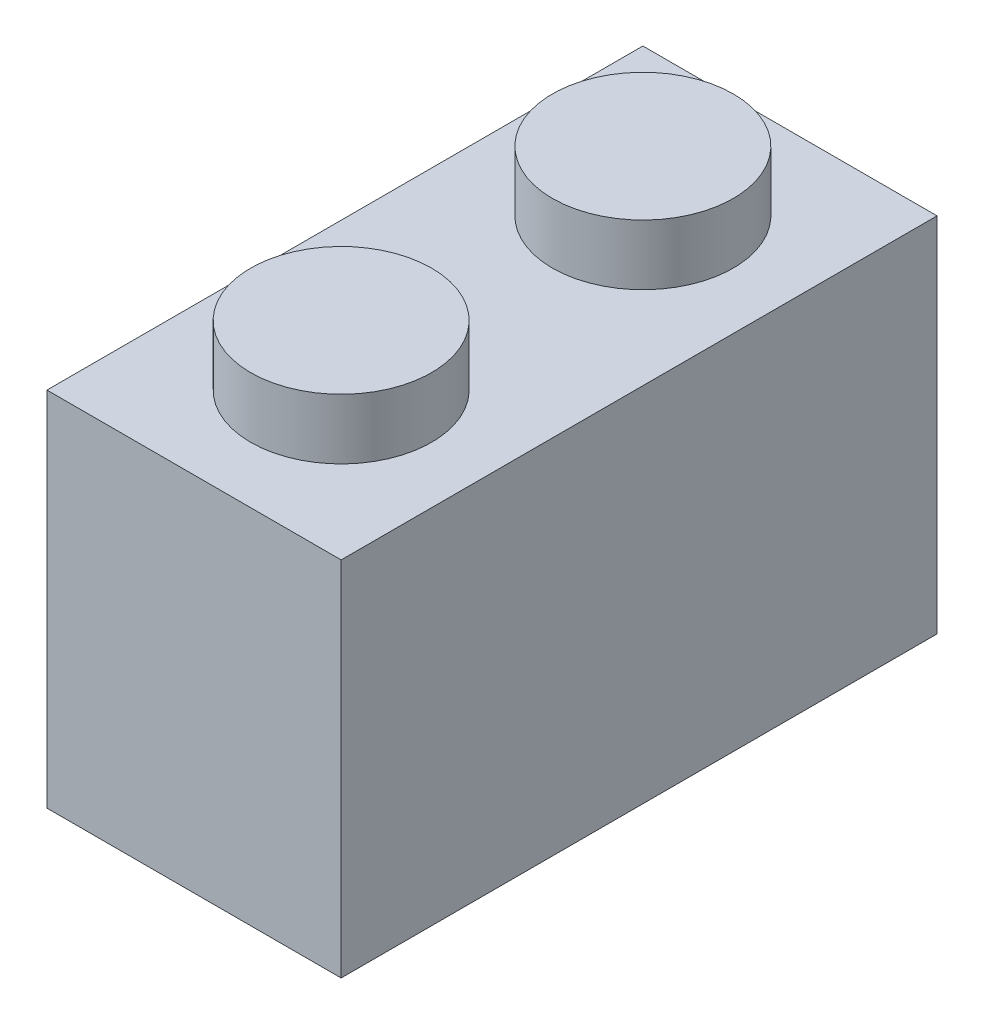
ISO-10303-21;
HEADER;
FILE_DESCRIPTION(('STEP AP214'),'2;1');
FILE_NAME('part.step','',(''),(''),'','','');
FILE_SCHEMA(('AUTOMOTIVE_DESIGN { 1 0 10303 214 1 1 1 1 }'));
ENDSEC;
DATA;
#1=APPLICATION_CONTEXT('core data for automotive mechanical design processes');
#2=APPLICATION_PROTOCOL_DEFINITION('international standard','automotive_design',2000,#1);
#3=PRODUCT_CONTEXT('',#1,'mechanical');
#4=PRODUCT('Part','Part','',(#3));
#5=PRODUCT_RELATED_PRODUCT_CATEGORY('part','',(#4));
#6=PRODUCT_DEFINITION_FORMATION('','',#4);
#7=PRODUCT_DEFINITION_CONTEXT('part definition',#1,'design');
#8=PRODUCT_DEFINITION('design','',#6,#7);
#9=PRODUCT_DEFINITION_SHAPE('','',#8);
#10=(LENGTH_UNIT() NAMED_UNIT(*) SI_UNIT(.MILLI.,.METRE.));
#11=(NAMED_UNIT(*) PLANE_ANGLE_UNIT() SI_UNIT($,.RADIAN.));
#12=(NAMED_UNIT(*) SI_UNIT($,.STERADIAN.) SOLID_ANGLE_UNIT());
#13=UNCERTAINTY_MEASURE_WITH_UNIT(LENGTH_MEASURE(1.E-05),#10,'distance_accuracy_value','');
#14=(GEOMETRIC_REPRESENTATION_CONTEXT(3) GLOBAL_UNCERTAINTY_ASSIGNED_CONTEXT((#13)) GLOBAL_UNIT_ASSIGNED_CONTEXT((#10,
#11,#12)) REPRESENTATION_CONTEXT('',''));
#15=CARTESIAN_POINT('',(0.,0.,0.));
#16=DIRECTION('',(0.,0.,1.));
#17=DIRECTION('',(1.,0.,0.));
#18=AXIS2_PLACEMENT_3D('',#15,#16,#17);
#19=CARTESIAN_POINT('',(0.,0.,-15.8));
#20=DIRECTION('',(0.,-1.,0.));
#21=DIRECTION('',(0.,0.,-1.));
#22=AXIS2_PLACEMENT_3D('',#19,#20,#21);
#23=PLANE('',#22);
#24=DIRECTION('',(1.,0.,0.));
#25=VECTOR('',#24,1.);
#26=CARTESIAN_POINT('',(0.,0.,0.));
#27=LINE('',#26,#25);
#28=CARTESIAN_POINT('',(0.,0.,0.));
#29=VERTEX_POINT('',#28);
#30=CARTESIAN_POINT('',(7.8,0.,0.));
#31=VERTEX_POINT('',#30);
#32=EDGE_CURVE('E186',#29,#31,#27,.T.);
#33=ORIENTED_EDGE('',*,*,#32,.F.);
#34=DIRECTION('',(0.,0.,1.));
#35=VECTOR('',#34,1.);
#36=CARTESIAN_POINT('',(0.,0.,-15.8));
#37=LINE('',#36,#35);
#38=CARTESIAN_POINT('',(0.,0.,-15.8));
#39=VERTEX_POINT('',#38);
#40=EDGE_CURVE('E92',#39,#29,#37,.T.);
#41=ORIENTED_EDGE('',*,*,#40,.F.);
#42=DIRECTION('',(1.,0.,0.));
#43=VECTOR('',#42,1.);
#44=CARTESIAN_POINT('',(0.,0.,-15.8));
#45=LINE('',#44,#43);
#46=CARTESIAN_POINT('',(7.8,0.,-15.8));
#47=VERTEX_POINT('',#46);
#48=EDGE_CURVE('E176',#39,#47,#45,.T.);
#49=ORIENTED_EDGE('',*,*,#48,.T.);
#50=DIRECTION('',(0.,0.,1.));
#51=VECTOR('',#50,1.);
#52=CARTESIAN_POINT('',(7.8,0.,-15.8));
#53=LINE('',#52,#51);
#54=EDGE_CURVE('E197',#47,#31,#53,.T.);
#55=ORIENTED_EDGE('',*,*,#54,.T.);
#56=EDGE_LOOP('',(#33,#41,#49,#55));
#57=FACE_BOUND('',#56,.T.);
#58=DIRECTION('',(0.,0.,1.));
#59=VECTOR('',#58,1.);
#60=CARTESIAN_POINT('',(1.2,0.,-15.8));
#61=LINE('',#60,#59);
#62=CARTESIAN_POINT('',(1.2,0.,-14.6));
#63=VERTEX_POINT('',#62);
#64=CARTESIAN_POINT('',(1.2,0.,-1.2));
#65=VERTEX_POINT('',#64);
#66=EDGE_CURVE('E134',#63,#65,#61,.T.);
#67=ORIENTED_EDGE('',*,*,#66,.T.);
#68=DIRECTION('',(1.,0.,0.));
#69=VECTOR('',#68,1.);
#70=CARTESIAN_POINT('',(0.,0.,-1.2));
#71=LINE('',#70,#69);
#72=CARTESIAN_POINT('',(6.6,0.,-1.2));
#73=VERTEX_POINT('',#72);
#74=EDGE_CURVE('E147',#65,#73,#71,.T.);
#75=ORIENTED_EDGE('',*,*,#74,.T.);
#76=DIRECTION('',(0.,0.,1.));
#77=VECTOR('',#76,1.);
#78=CARTESIAN_POINT('',(6.6,0.,-15.8));
#79=LINE('',#78,#77);
#80=CARTESIAN_POINT('',(6.6,0.,-14.6));
#81=VERTEX_POINT('',#80);
#82=EDGE_CURVE('E139',#81,#73,#79,.T.);
#83=ORIENTED_EDGE('',*,*,#82,.F.);
#84=DIRECTION('',(1.,0.,0.));
#85=VECTOR('',#84,1.);
#86=CARTESIAN_POINT('',(0.,0.,-14.6));
#87=LINE('',#86,#85);
#88=EDGE_CURVE('E58',#63,#81,#87,.T.);
#89=ORIENTED_EDGE('',*,*,#88,.F.);
#90=EDGE_LOOP('',(#67,#75,#83,#89));
#91=FACE_BOUND('',#90,.T.);
#92=ADVANCED_FACE('F43',(#57,#91),#23,.T.);
#93=CARTESIAN_POINT('',(0.,0.,-15.8));
#94=DIRECTION('',(-1.,0.,0.));
#95=DIRECTION('',(0.,0.,1.));
#96=AXIS2_PLACEMENT_3D('',#93,#94,#95);
#97=PLANE('',#96);
#98=DIRECTION('',(0.,-1.,0.));
#99=VECTOR('',#98,1.);
#100=CARTESIAN_POINT('',(0.,0.,0.));
#101=LINE('',#100,#99);
#102=CARTESIAN_POINT('',(0.,9.6,0.));
#103=VERTEX_POINT('',#102);
#104=EDGE_CURVE('E171',#103,#29,#101,.T.);
#105=ORIENTED_EDGE('',*,*,#104,.F.);
#106=DIRECTION('',(0.,0.,1.));
#107=VECTOR('',#106,1.);
#108=CARTESIAN_POINT('',(0.,9.6,-15.8));
#109=LINE('',#108,#107);
#110=CARTESIAN_POINT('',(0.,9.6,-15.8));
#111=VERTEX_POINT('',#110);
#112=EDGE_CURVE('E51',#111,#103,#109,.T.);
#113=ORIENTED_EDGE('',*,*,#112,.F.);
#114=DIRECTION('',(0.,-1.,0.));
#115=VECTOR('',#114,1.);
#116=CARTESIAN_POINT('',(0.,0.,-15.8));
#117=LINE('',#116,#115);
#118=EDGE_CURVE('E174',#111,#39,#117,.T.);
#119=ORIENTED_EDGE('',*,*,#118,.T.);
#120=ORIENTED_EDGE('',*,*,#40,.T.);
#121=EDGE_LOOP('',(#105,#113,#119,#120));
#122=FACE_BOUND('',#121,.T.);
#123=ADVANCED_FACE('F45',(#122),#97,.T.);
#124=CARTESIAN_POINT('',(0.,9.6,-15.8));
#125=DIRECTION('',(0.,1.,0.));
#126=DIRECTION('',(0.,0.,1.));
#127=AXIS2_PLACEMENT_3D('',#124,#125,#126);
#128=PLANE('',#127);
#129=CARTESIAN_POINT('',(3.9,9.6,-11.9));
#130=DIRECTION('',(0.,1.,0.));
#131=DIRECTION('',(0.,0.,1.));
#132=AXIS2_PLACEMENT_3D('',#129,#130,#131);
#133=CIRCLE('',#132,2.4);
#134=CARTESIAN_POINT('',(3.9,9.6,-9.5));
#135=VERTEX_POINT('',#134);
#136=EDGE_CURVE('E128',#135,#135,#133,.T.);
#137=ORIENTED_EDGE('',*,*,#136,.F.);
#138=EDGE_LOOP('',(#137));
#139=FACE_BOUND('',#138,.T.);
#140=CARTESIAN_POINT('',(3.9,9.6,-3.9));
#141=DIRECTION('',(0.,1.,0.));
#142=DIRECTION('',(0.,0.,1.));
#143=AXIS2_PLACEMENT_3D('',#140,#141,#142);
#144=CIRCLE('',#143,2.4);
#145=CARTESIAN_POINT('',(3.9,9.6,-1.5));
#146=VERTEX_POINT('',#145);
#147=EDGE_CURVE('E167',#146,#146,#144,.T.);
#148=ORIENTED_EDGE('',*,*,#147,.F.);
#149=EDGE_LOOP('',(#148));
#150=FACE_BOUND('',#149,.T.);
#151=DIRECTION('',(-1.,0.,0.));
#152=VECTOR('',#151,1.);
#153=CARTESIAN_POINT('',(0.,9.6,0.));
#154=LINE('',#153,#152);
#155=CARTESIAN_POINT('',(7.8,9.6,0.));
#156=VERTEX_POINT('',#155);
#157=EDGE_CURVE('E177',#156,#103,#154,.T.);
#158=ORIENTED_EDGE('',*,*,#157,.F.);
#159=DIRECTION('',(0.,0.,1.));
#160=VECTOR('',#159,1.);
#161=CARTESIAN_POINT('',(7.8,9.6,-15.8));
#162=LINE('',#161,#160);
#163=CARTESIAN_POINT('',(7.8,9.6,-15.8));
#164=VERTEX_POINT('',#163);
#165=EDGE_CURVE('E195',#164,#156,#162,.T.);
#166=ORIENTED_EDGE('',*,*,#165,.F.);
#167=DIRECTION('',(-1.,0.,0.));
#168=VECTOR('',#167,1.);
#169=CARTESIAN_POINT('',(0.,9.6,-15.8));
#170=LINE('',#169,#168);
#171=EDGE_CURVE('E182',#164,#111,#170,.T.);
#172=ORIENTED_EDGE('',*,*,#171,.T.);
#173=ORIENTED_EDGE('',*,*,#112,.T.);
#174=EDGE_LOOP('',(#158,#166,#172,#173));
#175=FACE_BOUND('',#174,.T.);
#176=ADVANCED_FACE('F202',(#139,#150,#175),#128,.T.);
#177=CARTESIAN_POINT('',(7.8,0.,-15.8));
#178=DIRECTION('',(1.,0.,0.));
#179=DIRECTION('',(0.,0.,-1.));
#180=AXIS2_PLACEMENT_3D('',#177,#178,#179);
#181=PLANE('',#180);
#182=DIRECTION('',(0.,1.,0.));
#183=VECTOR('',#182,1.);
#184=CARTESIAN_POINT('',(7.8,0.,0.));
#185=LINE('',#184,#183);
#186=EDGE_CURVE('E189',#31,#156,#185,.T.);
#187=ORIENTED_EDGE('',*,*,#186,.F.);
#188=ORIENTED_EDGE('',*,*,#54,.F.);
#189=DIRECTION('',(0.,1.,0.));
#190=VECTOR('',#189,1.);
#191=CARTESIAN_POINT('',(7.8,0.,-15.8));
#192=LINE('',#191,#190);
#193=EDGE_CURVE('E179',#47,#164,#192,.T.);
#194=ORIENTED_EDGE('',*,*,#193,.T.);
#195=ORIENTED_EDGE('',*,*,#165,.T.);
#196=EDGE_LOOP('',(#187,#188,#194,#195));
#197=FACE_BOUND('',#196,.T.);
#198=ADVANCED_FACE('F206',(#197),#181,.T.);
#199=CARTESIAN_POINT('',(0.,0.,-15.8));
#200=DIRECTION('',(0.,0.,-1.));
#201=DIRECTION('',(-1.,0.,0.));
#202=AXIS2_PLACEMENT_3D('',#199,#200,#201);
#203=PLANE('',#202);
#204=ORIENTED_EDGE('',*,*,#118,.F.);
#205=ORIENTED_EDGE('',*,*,#171,.F.);
#206=ORIENTED_EDGE('',*,*,#193,.F.);
#207=ORIENTED_EDGE('',*,*,#48,.F.);
#208=EDGE_LOOP('',(#204,#205,#206,#207));
#209=FACE_BOUND('',#208,.T.);
#210=ADVANCED_FACE('F208',(#209),#203,.T.);
#211=CARTESIAN_POINT('',(0.,0.,0.));
#212=DIRECTION('',(0.,0.,-1.));
#213=DIRECTION('',(-1.,0.,0.));
#214=AXIS2_PLACEMENT_3D('',#211,#212,#213);
#215=PLANE('',#214);
#216=ORIENTED_EDGE('',*,*,#104,.T.);
#217=ORIENTED_EDGE('',*,*,#32,.T.);
#218=ORIENTED_EDGE('',*,*,#186,.T.);
#219=ORIENTED_EDGE('',*,*,#157,.T.);
#220=EDGE_LOOP('',(#216,#217,#218,#219));
#221=FACE_BOUND('',#220,.T.);
#222=ADVANCED_FACE('F201',(#221),#215,.F.);
#223=CARTESIAN_POINT('',(3.9,11.2,-3.9));
#224=DIRECTION('',(0.,-1.,0.));
#225=DIRECTION('',(0.,0.,-1.));
#226=AXIS2_PLACEMENT_3D('',#223,#224,#225);
#227=CYLINDRICAL_SURFACE('',#226,2.4);
#228=CARTESIAN_POINT('',(3.9,11.2,-3.9));
#229=DIRECTION('',(0.,1.,0.));
#230=DIRECTION('',(0.,0.,1.));
#231=AXIS2_PLACEMENT_3D('',#228,#229,#230);
#232=CIRCLE('',#231,2.4);
#233=CARTESIAN_POINT('',(3.9,11.2,-1.5));
#234=VERTEX_POINT('',#233);
#235=EDGE_CURVE('E168',#234,#234,#232,.T.);
#236=ORIENTED_EDGE('',*,*,#235,.F.);
#237=EDGE_LOOP('',(#236));
#238=FACE_BOUND('',#237,.T.);
#239=ORIENTED_EDGE('',*,*,#147,.T.);
#240=EDGE_LOOP('',(#239));
#241=FACE_BOUND('',#240,.T.);
#242=ADVANCED_FACE('F215',(#238,#241),#227,.T.);
#243=CARTESIAN_POINT('',(3.9,11.2,-3.9));
#244=DIRECTION('',(0.,1.,0.));
#245=DIRECTION('',(0.,0.,1.));
#246=AXIS2_PLACEMENT_3D('',#243,#244,#245);
#247=PLANE('',#246);
#248=ORIENTED_EDGE('',*,*,#235,.T.);
#249=EDGE_LOOP('',(#248));
#250=FACE_BOUND('',#249,.T.);
#251=ADVANCED_FACE('F233',(#250),#247,.T.);
#252=CARTESIAN_POINT('',(3.9,11.2,-11.9));
#253=DIRECTION('',(0.,-1.,0.));
#254=DIRECTION('',(0.,0.,-1.));
#255=AXIS2_PLACEMENT_3D('',#252,#253,#254);
#256=CYLINDRICAL_SURFACE('',#255,2.4);
#257=CARTESIAN_POINT('',(3.9,11.2,-11.9));
#258=DIRECTION('',(0.,1.,0.));
#259=DIRECTION('',(0.,0.,1.));
#260=AXIS2_PLACEMENT_3D('',#257,#258,#259);
#261=CIRCLE('',#260,2.4);
#262=CARTESIAN_POINT('',(3.9,11.2,-9.5));
#263=VERTEX_POINT('',#262);
#264=EDGE_CURVE('E164',#263,#263,#261,.T.);
#265=ORIENTED_EDGE('',*,*,#264,.F.);
#266=EDGE_LOOP('',(#265));
#267=FACE_BOUND('',#266,.T.);
#268=ORIENTED_EDGE('',*,*,#136,.T.);
#269=EDGE_LOOP('',(#268));
#270=FACE_BOUND('',#269,.T.);
#271=ADVANCED_FACE('F238',(#267,#270),#256,.T.);
#272=CARTESIAN_POINT('',(3.9,11.2,-11.9));
#273=DIRECTION('',(0.,1.,0.));
#274=DIRECTION('',(0.,0.,1.));
#275=AXIS2_PLACEMENT_3D('',#272,#273,#274);
#276=PLANE('',#275);
#277=ORIENTED_EDGE('',*,*,#264,.T.);
#278=EDGE_LOOP('',(#277));
#279=FACE_BOUND('',#278,.T.);
#280=ADVANCED_FACE('F245',(#279),#276,.T.);
#281=CARTESIAN_POINT('',(1.2,0.,-15.8));
#282=DIRECTION('',(-1.,0.,0.));
#283=DIRECTION('',(0.,0.,1.));
#284=AXIS2_PLACEMENT_3D('',#281,#282,#283);
#285=PLANE('',#284);
#286=DIRECTION('',(0.,-1.,0.));
#287=VECTOR('',#286,1.);
#288=CARTESIAN_POINT('',(1.2,0.,-1.2));
#289=LINE('',#288,#287);
#290=CARTESIAN_POINT('',(1.2,8.4,-1.2));
#291=VERTEX_POINT('',#290);
#292=EDGE_CURVE('E152',#291,#65,#289,.T.);
#293=ORIENTED_EDGE('',*,*,#292,.T.);
#294=ORIENTED_EDGE('',*,*,#66,.F.);
#295=DIRECTION('',(0.,-1.,0.));
#296=VECTOR('',#295,1.);
#297=CARTESIAN_POINT('',(1.2,0.,-14.6));
#298=LINE('',#297,#296);
#299=CARTESIAN_POINT('',(1.2,8.4,-14.6));
#300=VERTEX_POINT('',#299);
#301=EDGE_CURVE('E131',#300,#63,#298,.T.);
#302=ORIENTED_EDGE('',*,*,#301,.F.);
#303=DIRECTION('',(0.,0.,1.));
#304=VECTOR('',#303,1.);
#305=CARTESIAN_POINT('',(1.2,8.4,-15.8));
#306=LINE('',#305,#304);
#307=EDGE_CURVE('E118',#300,#291,#306,.T.);
#308=ORIENTED_EDGE('',*,*,#307,.T.);
#309=EDGE_LOOP('',(#293,#294,#302,#308));
#310=FACE_BOUND('',#309,.T.);
#311=ADVANCED_FACE('F132',(#310),#285,.F.);
#312=CARTESIAN_POINT('',(0.,8.4,-15.8));
#313=DIRECTION('',(0.,1.,0.));
#314=DIRECTION('',(0.,0.,1.));
#315=AXIS2_PLACEMENT_3D('',#312,#313,#314);
#316=PLANE('',#315);
#317=CARTESIAN_POINT('',(3.9,8.4,-7.9));
#318=DIRECTION('',(0.,1.,0.));
#319=DIRECTION('',(0.,0.,1.));
#320=AXIS2_PLACEMENT_3D('',#317,#318,#319);
#321=CIRCLE('',#320,1.5);
#322=CARTESIAN_POINT('',(3.9,8.4,-6.4));
#323=VERTEX_POINT('',#322);
#324=EDGE_CURVE('E12',#323,#323,#321,.F.);
#325=ORIENTED_EDGE('',*,*,#324,.F.);
#326=EDGE_LOOP('',(#325));
#327=FACE_BOUND('',#326,.T.);
#328=CARTESIAN_POINT('',(3.9,8.4,-11.9));
#329=DIRECTION('',(0.,1.,0.));
#330=DIRECTION('',(0.,0.,1.));
#331=AXIS2_PLACEMENT_3D('',#328,#329,#330);
#332=CIRCLE('',#331,1.2);
#333=CARTESIAN_POINT('',(3.9,8.4,-10.7));
#334=VERTEX_POINT('',#333);
#335=EDGE_CURVE('E156',#334,#334,#332,.T.);
#336=ORIENTED_EDGE('',*,*,#335,.T.);
#337=EDGE_LOOP('',(#336));
#338=FACE_BOUND('',#337,.T.);
#339=CARTESIAN_POINT('',(3.9,8.4,-3.9));
#340=DIRECTION('',(0.,1.,0.));
#341=DIRECTION('',(0.,0.,1.));
#342=AXIS2_PLACEMENT_3D('',#339,#340,#341);
#343=CIRCLE('',#342,1.2);
#344=CARTESIAN_POINT('',(3.9,8.4,-2.7));
#345=VERTEX_POINT('',#344);
#346=EDGE_CURVE('E153',#345,#345,#343,.T.);
#347=ORIENTED_EDGE('',*,*,#346,.T.);
#348=EDGE_LOOP('',(#347));
#349=FACE_BOUND('',#348,.T.);
#350=DIRECTION('',(-1.,0.,0.));
#351=VECTOR('',#350,1.);
#352=CARTESIAN_POINT('',(0.,8.4,-1.2));
#353=LINE('',#352,#351);
#354=CARTESIAN_POINT('',(6.6,8.4,-1.2));
#355=VERTEX_POINT('',#354);
#356=EDGE_CURVE('E124',#355,#291,#353,.T.);
#357=ORIENTED_EDGE('',*,*,#356,.T.);
#358=ORIENTED_EDGE('',*,*,#307,.F.);
#359=DIRECTION('',(-1.,0.,0.));
#360=VECTOR('',#359,1.);
#361=CARTESIAN_POINT('',(0.,8.4,-14.6));
#362=LINE('',#361,#360);
#363=CARTESIAN_POINT('',(6.6,8.4,-14.6));
#364=VERTEX_POINT('',#363);
#365=EDGE_CURVE('E122',#364,#300,#362,.T.);
#366=ORIENTED_EDGE('',*,*,#365,.F.);
#367=DIRECTION('',(0.,0.,1.));
#368=VECTOR('',#367,1.);
#369=CARTESIAN_POINT('',(6.6,8.4,-15.8));
#370=LINE('',#369,#368);
#371=EDGE_CURVE('E129',#364,#355,#370,.T.);
#372=ORIENTED_EDGE('',*,*,#371,.T.);
#373=EDGE_LOOP('',(#357,#358,#366,#372));
#374=FACE_BOUND('',#373,.T.);
#375=ADVANCED_FACE('F120',(#327,#338,#349,#374),#316,.F.);
#376=CARTESIAN_POINT('',(6.6,0.,-15.8));
#377=DIRECTION('',(1.,0.,0.));
#378=DIRECTION('',(0.,0.,-1.));
#379=AXIS2_PLACEMENT_3D('',#376,#377,#378);
#380=PLANE('',#379);
#381=DIRECTION('',(0.,1.,0.));
#382=VECTOR('',#381,1.);
#383=CARTESIAN_POINT('',(6.6,0.,-1.2));
#384=LINE('',#383,#382);
#385=EDGE_CURVE('E145',#73,#355,#384,.T.);
#386=ORIENTED_EDGE('',*,*,#385,.T.);
#387=ORIENTED_EDGE('',*,*,#371,.F.);
#388=DIRECTION('',(0.,1.,0.));
#389=VECTOR('',#388,1.);
#390=CARTESIAN_POINT('',(6.6,0.,-14.6));
#391=LINE('',#390,#389);
#392=EDGE_CURVE('E137',#81,#364,#391,.T.);
#393=ORIENTED_EDGE('',*,*,#392,.F.);
#394=ORIENTED_EDGE('',*,*,#82,.T.);
#395=EDGE_LOOP('',(#386,#387,#393,#394));
#396=FACE_BOUND('',#395,.T.);
#397=ADVANCED_FACE('F273',(#396),#380,.F.);
#398=CARTESIAN_POINT('',(0.,0.,-14.6));
#399=DIRECTION('',(0.,0.,-1.));
#400=DIRECTION('',(-1.,0.,0.));
#401=AXIS2_PLACEMENT_3D('',#398,#399,#400);
#402=PLANE('',#401);
#403=ORIENTED_EDGE('',*,*,#301,.T.);
#404=ORIENTED_EDGE('',*,*,#88,.T.);
#405=ORIENTED_EDGE('',*,*,#392,.T.);
#406=ORIENTED_EDGE('',*,*,#365,.T.);
#407=EDGE_LOOP('',(#403,#404,#405,#406));
#408=FACE_BOUND('',#407,.T.);
#409=ADVANCED_FACE('F136',(#408),#402,.F.);
#410=CARTESIAN_POINT('',(0.,0.,-1.2));
#411=DIRECTION('',(0.,0.,-1.));
#412=DIRECTION('',(-1.,0.,0.));
#413=AXIS2_PLACEMENT_3D('',#410,#411,#412);
#414=PLANE('',#413);
#415=ORIENTED_EDGE('',*,*,#292,.F.);
#416=ORIENTED_EDGE('',*,*,#356,.F.);
#417=ORIENTED_EDGE('',*,*,#385,.F.);
#418=ORIENTED_EDGE('',*,*,#74,.F.);
#419=EDGE_LOOP('',(#415,#416,#417,#418));
#420=FACE_BOUND('',#419,.T.);
#421=ADVANCED_FACE('F266',(#420),#414,.T.);
#422=CARTESIAN_POINT('',(3.9,11.2,-3.9));
#423=DIRECTION('',(0.,-1.,0.));
#424=DIRECTION('',(0.,0.,-1.));
#425=AXIS2_PLACEMENT_3D('',#422,#423,#424);
#426=CYLINDRICAL_SURFACE('',#425,1.2);
#427=CARTESIAN_POINT('',(3.9,10.,-3.9));
#428=DIRECTION('',(0.,1.,0.));
#429=DIRECTION('',(0.,0.,1.));
#430=AXIS2_PLACEMENT_3D('',#427,#428,#429);
#431=CIRCLE('',#430,1.2);
#432=CARTESIAN_POINT('',(3.9,10.,-2.7));
#433=VERTEX_POINT('',#432);
#434=EDGE_CURVE('E149',#433,#433,#431,.T.);
#435=ORIENTED_EDGE('',*,*,#434,.T.);
#436=EDGE_LOOP('',(#435));
#437=FACE_BOUND('',#436,.T.);
#438=ORIENTED_EDGE('',*,*,#346,.F.);
#439=EDGE_LOOP('',(#438));
#440=FACE_BOUND('',#439,.T.);
#441=ADVANCED_FACE('F262',(#437,#440),#426,.F.);
#442=CARTESIAN_POINT('',(3.9,10.,-3.9));
#443=DIRECTION('',(0.,1.,0.));
#444=DIRECTION('',(0.,0.,1.));
#445=AXIS2_PLACEMENT_3D('',#442,#443,#444);
#446=PLANE('',#445);
#447=ORIENTED_EDGE('',*,*,#434,.F.);
#448=EDGE_LOOP('',(#447));
#449=FACE_BOUND('',#448,.T.);
#450=ADVANCED_FACE('F258',(#449),#446,.F.);
#451=CARTESIAN_POINT('',(3.9,11.2,-11.9));
#452=DIRECTION('',(0.,-1.,0.));
#453=DIRECTION('',(0.,0.,-1.));
#454=AXIS2_PLACEMENT_3D('',#451,#452,#453);
#455=CYLINDRICAL_SURFACE('',#454,1.2);
#456=CARTESIAN_POINT('',(3.9,10.,-11.9));
#457=DIRECTION('',(0.,1.,0.));
#458=DIRECTION('',(0.,0.,1.));
#459=AXIS2_PLACEMENT_3D('',#456,#457,#458);
#460=CIRCLE('',#459,1.2);
#461=CARTESIAN_POINT('',(3.9,10.,-10.7));
#462=VERTEX_POINT('',#461);
#463=EDGE_CURVE('E154',#462,#462,#460,.T.);
#464=ORIENTED_EDGE('',*,*,#463,.T.);
#465=EDGE_LOOP('',(#464));
#466=FACE_BOUND('',#465,.T.);
#467=ORIENTED_EDGE('',*,*,#335,.F.);
#468=EDGE_LOOP('',(#467));
#469=FACE_BOUND('',#468,.T.);
#470=ADVANCED_FACE('F254',(#466,#469),#455,.F.);
#471=CARTESIAN_POINT('',(3.9,10.,-11.9));
#472=DIRECTION('',(0.,1.,0.));
#473=DIRECTION('',(0.,0.,1.));
#474=AXIS2_PLACEMENT_3D('',#471,#472,#473);
#475=PLANE('',#474);
#476=ORIENTED_EDGE('',*,*,#463,.F.);
#477=EDGE_LOOP('',(#476));
#478=FACE_BOUND('',#477,.T.);
#479=ADVANCED_FACE('F250',(#478),#475,.F.);
#480=CARTESIAN_POINT('',(3.9,-4.24264068711929,-7.9));
#481=DIRECTION('',(0.,1.,0.));
#482=DIRECTION('',(0.,0.,1.));
#483=AXIS2_PLACEMENT_3D('',#480,#481,#482);
#484=CYLINDRICAL_SURFACE('',#483,1.5);
#485=ORIENTED_EDGE('',*,*,#324,.T.);
#486=EDGE_LOOP('',(#485));
#487=FACE_BOUND('',#486,.T.);
#488=CARTESIAN_POINT('',(3.9,0.2,-7.9));
#489=DIRECTION('',(0.,-1.,0.));
#490=DIRECTION('',(0.,0.,-1.));
#491=AXIS2_PLACEMENT_3D('',#488,#489,#490);
#492=CIRCLE('',#491,1.5);
#493=CARTESIAN_POINT('',(3.9,0.2,-9.4));
#494=VERTEX_POINT('',#493);
#495=EDGE_CURVE('E294',#494,#494,#492,.T.);
#496=ORIENTED_EDGE('',*,*,#495,.F.);
#497=EDGE_LOOP('',(#496));
#498=FACE_BOUND('',#497,.T.);
#499=ADVANCED_FACE('F253',(#487,#498),#484,.T.);
#500=CARTESIAN_POINT('',(0.,0.2,-15.8));
#501=DIRECTION('',(0.,-1.,0.));
#502=DIRECTION('',(0.,0.,-1.));
#503=AXIS2_PLACEMENT_3D('',#500,#501,#502);
#504=PLANE('',#503);
#505=ORIENTED_EDGE('',*,*,#495,.T.);
#506=EDGE_LOOP('',(#505));
#507=FACE_BOUND('',#506,.T.);
#508=ADVANCED_FACE('F282',(#507),#504,.T.);
#509=CLOSED_SHELL('',(#92,#123,#176,#198,#210,#222,#242,#251,#271,#280,#311,#375,#397,#409,#421,
#441,#450,#470,#479,#499,#508));
#510=MANIFOLD_SOLID_BREP('B2',#509);
#511=ADVANCED_BREP_SHAPE_REPRESENTATION('',(#18,#510),#14);
#512=SHAPE_DEFINITION_REPRESENTATION(#9,#511);
ENDSEC;
END-ISO-10303-21;
